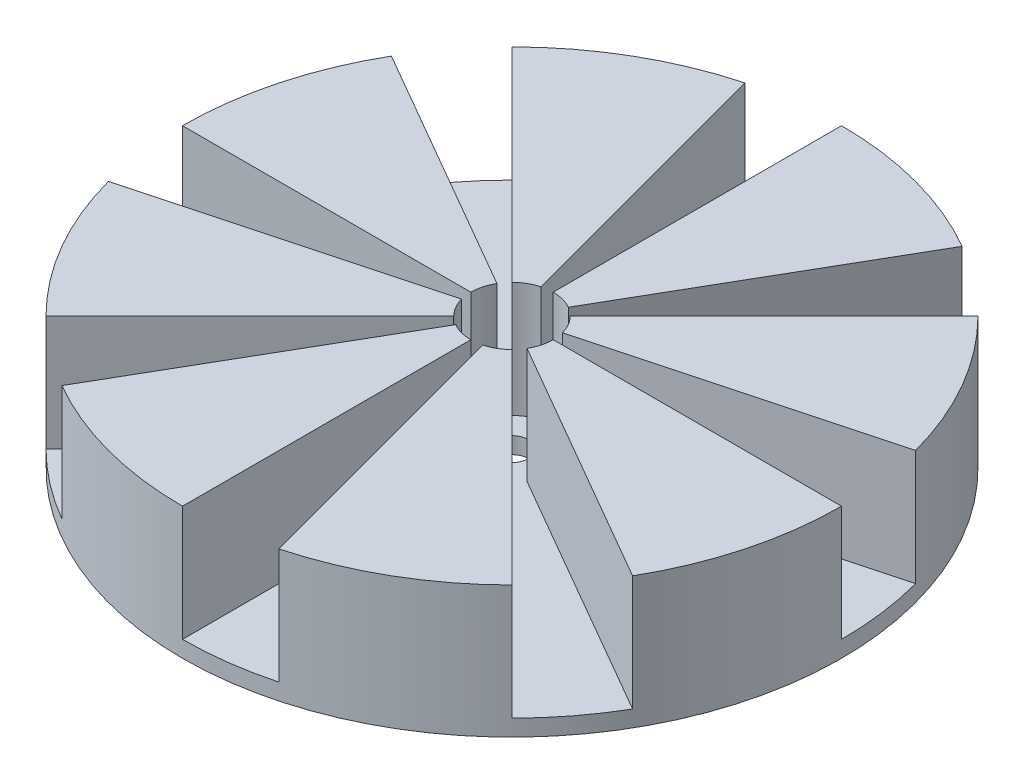
ISO-10303-21;
HEADER;
FILE_DESCRIPTION(('STEP AP214'),'2;1');
FILE_NAME('part.step','',(''),(''),'','','');
FILE_SCHEMA(('AUTOMOTIVE_DESIGN { 1 0 10303 214 1 1 1 1 }'));
ENDSEC;
DATA;
#1=APPLICATION_CONTEXT('core data for automotive mechanical design processes');
#2=APPLICATION_PROTOCOL_DEFINITION('international standard','automotive_design',2000,#1);
#3=PRODUCT_CONTEXT('',#1,'mechanical');
#4=PRODUCT('Part','Part','',(#3));
#5=PRODUCT_RELATED_PRODUCT_CATEGORY('part','',(#4));
#6=PRODUCT_DEFINITION_FORMATION('','',#4);
#7=PRODUCT_DEFINITION_CONTEXT('part definition',#1,'design');
#8=PRODUCT_DEFINITION('design','',#6,#7);
#9=PRODUCT_DEFINITION_SHAPE('','',#8);
#10=(LENGTH_UNIT() NAMED_UNIT(*) SI_UNIT(.MILLI.,.METRE.));
#11=(NAMED_UNIT(*) PLANE_ANGLE_UNIT() SI_UNIT($,.RADIAN.));
#12=(NAMED_UNIT(*) SI_UNIT($,.STERADIAN.) SOLID_ANGLE_UNIT());
#13=UNCERTAINTY_MEASURE_WITH_UNIT(LENGTH_MEASURE(1.E-05),#10,'distance_accuracy_value','');
#14=(GEOMETRIC_REPRESENTATION_CONTEXT(3) GLOBAL_UNCERTAINTY_ASSIGNED_CONTEXT((#13)) GLOBAL_UNIT_ASSIGNED_CONTEXT((#10,
#11,#12)) REPRESENTATION_CONTEXT('',''));
#15=CARTESIAN_POINT('',(0.,0.,0.));
#16=DIRECTION('',(0.,0.,1.));
#17=DIRECTION('',(1.,0.,0.));
#18=AXIS2_PLACEMENT_3D('',#15,#16,#17);
#19=CARTESIAN_POINT('',(0.,1.,0.));
#20=DIRECTION('',(0.,1.,0.));
#21=DIRECTION('',(0.,0.,1.));
#22=AXIS2_PLACEMENT_3D('',#19,#20,#21);
#23=PLANE('',#22);
#24=CARTESIAN_POINT('',(0.,1.,0.));
#25=DIRECTION('',(0.,1.,0.));
#26=DIRECTION('',(0.,0.,1.));
#27=AXIS2_PLACEMENT_3D('',#24,#25,#26);
#28=CIRCLE('',#27,1.);
#29=CARTESIAN_POINT('',(0.,1.,1.));
#30=VERTEX_POINT('',#29);
#31=EDGE_CURVE('E364',#30,#30,#28,.T.);
#32=ORIENTED_EDGE('',*,*,#31,.F.);
#33=EDGE_LOOP('',(#32));
#34=FACE_BOUND('',#33,.T.);
#35=CARTESIAN_POINT('',(0.,1.,0.));
#36=DIRECTION('',(0.,1.,0.));
#37=DIRECTION('',(0.,0.,1.));
#38=AXIS2_PLACEMENT_3D('',#35,#36,#37);
#39=CIRCLE('',#38,20.);
#40=CARTESIAN_POINT('',(-20.,1.,0.));
#41=VERTEX_POINT('',#40);
#42=CARTESIAN_POINT('',(-19.3185165257814,1.,5.17638090205045));
#43=VERTEX_POINT('',#42);
#44=EDGE_CURVE('E12',#41,#43,#39,.T.);
#45=ORIENTED_EDGE('',*,*,#44,.T.);
#46=DIRECTION('',(-0.965925826289068,0.,0.258819045102523));
#47=VECTOR('',#46,1.);
#48=CARTESIAN_POINT('',(0.,1.,0.));
#49=LINE('',#48,#47);
#50=CARTESIAN_POINT('',(-2.41481456572267,1.,0.647047612756305));
#51=VERTEX_POINT('',#50);
#52=EDGE_CURVE('E146',#51,#43,#49,.T.);
#53=ORIENTED_EDGE('',*,*,#52,.F.);
#54=CARTESIAN_POINT('',(0.,1.,0.));
#55=DIRECTION('',(0.,1.,0.));
#56=DIRECTION('',(0.,0.,1.));
#57=AXIS2_PLACEMENT_3D('',#54,#55,#56);
#58=CIRCLE('',#57,2.5);
#59=CARTESIAN_POINT('',(-1.76776695296636,1.,1.76776695296638));
#60=VERTEX_POINT('',#59);
#61=EDGE_CURVE('E151',#51,#60,#58,.T.);
#62=ORIENTED_EDGE('',*,*,#61,.T.);
#63=DIRECTION('',(-0.707106781186545,0.,0.70710678118655));
#64=VECTOR('',#63,1.);
#65=CARTESIAN_POINT('',(0.,1.,0.));
#66=LINE('',#65,#64);
#67=CARTESIAN_POINT('',(-14.1421356237309,1.,14.142135623731));
#68=VERTEX_POINT('',#67);
#69=EDGE_CURVE('E360',#60,#68,#66,.T.);
#70=ORIENTED_EDGE('',*,*,#69,.T.);
#71=CARTESIAN_POINT('',(-9.99999999999991,1.,17.3205080756888));
#72=VERTEX_POINT('',#71);
#73=EDGE_CURVE('E139',#68,#72,#39,.T.);
#74=ORIENTED_EDGE('',*,*,#73,.T.);
#75=DIRECTION('',(-0.499999999999995,0.,0.866025403784441));
#76=VECTOR('',#75,1.);
#77=CARTESIAN_POINT('',(0.,1.,0.));
#78=LINE('',#77,#76);
#79=CARTESIAN_POINT('',(-1.24999999999999,1.,2.1650635094611));
#80=VERTEX_POINT('',#79);
#81=EDGE_CURVE('E389',#80,#72,#78,.T.);
#82=ORIENTED_EDGE('',*,*,#81,.F.);
#83=CARTESIAN_POINT('',(0.,1.,0.));
#84=DIRECTION('',(0.,1.,0.));
#85=DIRECTION('',(0.,0.,1.));
#86=AXIS2_PLACEMENT_3D('',#83,#84,#85);
#87=CIRCLE('',#86,2.5);
#88=CARTESIAN_POINT('',(0.,1.,2.5));
#89=VERTEX_POINT('',#88);
#90=EDGE_CURVE('E346',#80,#89,#87,.T.);
#91=ORIENTED_EDGE('',*,*,#90,.T.);
#92=DIRECTION('',(0.,0.,1.));
#93=VECTOR('',#92,1.);
#94=CARTESIAN_POINT('',(0.,1.,0.));
#95=LINE('',#94,#93);
#96=CARTESIAN_POINT('',(0.,1.,20.));
#97=VERTEX_POINT('',#96);
#98=EDGE_CURVE('E380',#89,#97,#95,.T.);
#99=ORIENTED_EDGE('',*,*,#98,.T.);
#100=CARTESIAN_POINT('',(5.17638090205044,1.,19.3185165257814));
#101=VERTEX_POINT('',#100);
#102=EDGE_CURVE('E601',#97,#101,#39,.T.);
#103=ORIENTED_EDGE('',*,*,#102,.T.);
#104=DIRECTION('',(0.258819045102522,0.,0.965925826289068));
#105=VECTOR('',#104,1.);
#106=CARTESIAN_POINT('',(0.,1.,0.));
#107=LINE('',#106,#105);
#108=CARTESIAN_POINT('',(0.647047612756304,1.,2.41481456572267));
#109=VERTEX_POINT('',#108);
#110=EDGE_CURVE('E419',#109,#101,#107,.T.);
#111=ORIENTED_EDGE('',*,*,#110,.F.);
#112=CARTESIAN_POINT('',(0.,1.,0.));
#113=DIRECTION('',(0.,1.,0.));
#114=DIRECTION('',(0.,0.,1.));
#115=AXIS2_PLACEMENT_3D('',#112,#113,#114);
#116=CIRCLE('',#115,2.5);
#117=CARTESIAN_POINT('',(1.76776695296636,1.,1.76776695296638));
#118=VERTEX_POINT('',#117);
#119=EDGE_CURVE('E405',#109,#118,#116,.T.);
#120=ORIENTED_EDGE('',*,*,#119,.T.);
#121=DIRECTION('',(0.707106781186545,0.,0.70710678118655));
#122=VECTOR('',#121,1.);
#123=CARTESIAN_POINT('',(0.,1.,0.));
#124=LINE('',#123,#122);
#125=CARTESIAN_POINT('',(14.1421356237309,1.,14.142135623731));
#126=VERTEX_POINT('',#125);
#127=EDGE_CURVE('E410',#118,#126,#124,.T.);
#128=ORIENTED_EDGE('',*,*,#127,.T.);
#129=CARTESIAN_POINT('',(17.3205080756887,1.,10.));
#130=VERTEX_POINT('',#129);
#131=EDGE_CURVE('E599',#126,#130,#39,.T.);
#132=ORIENTED_EDGE('',*,*,#131,.T.);
#133=DIRECTION('',(0.866025403784437,0.,0.500000000000003));
#134=VECTOR('',#133,1.);
#135=CARTESIAN_POINT('',(0.,1.,0.));
#136=LINE('',#135,#134);
#137=CARTESIAN_POINT('',(2.16506350946109,1.,1.25000000000001));
#138=VERTEX_POINT('',#137);
#139=EDGE_CURVE('E449',#138,#130,#136,.T.);
#140=ORIENTED_EDGE('',*,*,#139,.F.);
#141=CARTESIAN_POINT('',(0.,1.,0.));
#142=DIRECTION('',(0.,1.,0.));
#143=DIRECTION('',(0.,0.,1.));
#144=AXIS2_PLACEMENT_3D('',#141,#142,#143);
#145=CIRCLE('',#144,2.5);
#146=CARTESIAN_POINT('',(2.5,1.,0.));
#147=VERTEX_POINT('',#146);
#148=EDGE_CURVE('E435',#138,#147,#145,.T.);
#149=ORIENTED_EDGE('',*,*,#148,.T.);
#150=DIRECTION('',(1.,0.,0.));
#151=VECTOR('',#150,1.);
#152=CARTESIAN_POINT('',(0.,1.,0.));
#153=LINE('',#152,#151);
#154=CARTESIAN_POINT('',(20.,1.,0.));
#155=VERTEX_POINT('',#154);
#156=EDGE_CURVE('E440',#147,#155,#153,.T.);
#157=ORIENTED_EDGE('',*,*,#156,.T.);
#158=CARTESIAN_POINT('',(19.3185165257814,1.,-5.17638090205046));
#159=VERTEX_POINT('',#158);
#160=EDGE_CURVE('E597',#155,#159,#39,.T.);
#161=ORIENTED_EDGE('',*,*,#160,.T.);
#162=DIRECTION('',(-0.965925826289068,0.,0.258819045102523));
#163=VECTOR('',#162,1.);
#164=CARTESIAN_POINT('',(0.,1.,0.));
#165=LINE('',#164,#163);
#166=CARTESIAN_POINT('',(2.41481456572267,1.,-0.647047612756306));
#167=VERTEX_POINT('',#166);
#168=EDGE_CURVE('E479',#159,#167,#165,.T.);
#169=ORIENTED_EDGE('',*,*,#168,.T.);
#170=CARTESIAN_POINT('',(0.,1.,0.));
#171=DIRECTION('',(0.,1.,0.));
#172=DIRECTION('',(0.,0.,1.));
#173=AXIS2_PLACEMENT_3D('',#170,#171,#172);
#174=CIRCLE('',#173,2.5);
#175=CARTESIAN_POINT('',(1.76776695296636,1.,-1.76776695296638));
#176=VERTEX_POINT('',#175);
#177=EDGE_CURVE('E465',#167,#176,#174,.T.);
#178=ORIENTED_EDGE('',*,*,#177,.T.);
#179=DIRECTION('',(-0.707106781186545,0.,0.70710678118655));
#180=VECTOR('',#179,1.);
#181=CARTESIAN_POINT('',(0.,1.,0.));
#182=LINE('',#181,#180);
#183=CARTESIAN_POINT('',(14.1421356237309,1.,-14.142135623731));
#184=VERTEX_POINT('',#183);
#185=EDGE_CURVE('E470',#184,#176,#182,.T.);
#186=ORIENTED_EDGE('',*,*,#185,.F.);
#187=CARTESIAN_POINT('',(9.9999999999999,1.,-17.3205080756888));
#188=VERTEX_POINT('',#187);
#189=EDGE_CURVE('E594',#184,#188,#39,.T.);
#190=ORIENTED_EDGE('',*,*,#189,.T.);
#191=DIRECTION('',(-0.499999999999995,0.,0.866025403784441));
#192=VECTOR('',#191,1.);
#193=CARTESIAN_POINT('',(0.,1.,0.));
#194=LINE('',#193,#192);
#195=CARTESIAN_POINT('',(1.24999999999999,1.,-2.1650635094611));
#196=VERTEX_POINT('',#195);
#197=EDGE_CURVE('E509',#188,#196,#194,.T.);
#198=ORIENTED_EDGE('',*,*,#197,.T.);
#199=CARTESIAN_POINT('',(0.,1.,0.));
#200=DIRECTION('',(0.,1.,0.));
#201=DIRECTION('',(0.,0.,1.));
#202=AXIS2_PLACEMENT_3D('',#199,#200,#201);
#203=CIRCLE('',#202,2.5);
#204=CARTESIAN_POINT('',(0.,1.,-2.5));
#205=VERTEX_POINT('',#204);
#206=EDGE_CURVE('E494',#196,#205,#203,.T.);
#207=ORIENTED_EDGE('',*,*,#206,.T.);
#208=DIRECTION('',(0.,0.,-1.));
#209=VECTOR('',#208,1.);
#210=CARTESIAN_POINT('',(0.,1.,0.));
#211=LINE('',#210,#209);
#212=CARTESIAN_POINT('',(0.,1.,-20.));
#213=VERTEX_POINT('',#212);
#214=EDGE_CURVE('E499',#205,#213,#211,.T.);
#215=ORIENTED_EDGE('',*,*,#214,.T.);
#216=CARTESIAN_POINT('',(-5.17638090205043,1.,-19.3185165257814));
#217=VERTEX_POINT('',#216);
#218=EDGE_CURVE('E582',#213,#217,#39,.T.);
#219=ORIENTED_EDGE('',*,*,#218,.T.);
#220=DIRECTION('',(-0.258819045102522,0.,-0.965925826289068));
#221=VECTOR('',#220,1.);
#222=CARTESIAN_POINT('',(0.,1.,0.));
#223=LINE('',#222,#221);
#224=CARTESIAN_POINT('',(-0.647047612756304,1.,-2.41481456572267));
#225=VERTEX_POINT('',#224);
#226=EDGE_CURVE('E537',#225,#217,#223,.T.);
#227=ORIENTED_EDGE('',*,*,#226,.F.);
#228=CARTESIAN_POINT('',(0.,1.,0.));
#229=DIRECTION('',(0.,1.,0.));
#230=DIRECTION('',(0.,0.,1.));
#231=AXIS2_PLACEMENT_3D('',#228,#229,#230);
#232=CIRCLE('',#231,2.5);
#233=CARTESIAN_POINT('',(-1.76776695296636,1.,-1.76776695296638));
#234=VERTEX_POINT('',#233);
#235=EDGE_CURVE('E524',#225,#234,#232,.T.);
#236=ORIENTED_EDGE('',*,*,#235,.T.);
#237=DIRECTION('',(0.707106781186545,0.,0.70710678118655));
#238=VECTOR('',#237,1.);
#239=CARTESIAN_POINT('',(0.,1.,0.));
#240=LINE('',#239,#238);
#241=CARTESIAN_POINT('',(-14.1421356237309,1.,-14.142135623731));
#242=VERTEX_POINT('',#241);
#243=EDGE_CURVE('E529',#242,#234,#240,.T.);
#244=ORIENTED_EDGE('',*,*,#243,.F.);
#245=CARTESIAN_POINT('',(-17.3205080756887,1.,-10.0000000000001));
#246=VERTEX_POINT('',#245);
#247=EDGE_CURVE('E579',#242,#246,#39,.T.);
#248=ORIENTED_EDGE('',*,*,#247,.T.);
#249=DIRECTION('',(0.866025403784437,0.,0.500000000000003));
#250=VECTOR('',#249,1.);
#251=CARTESIAN_POINT('',(0.,1.,0.));
#252=LINE('',#251,#250);
#253=CARTESIAN_POINT('',(-2.16506350946109,1.,-1.25000000000001));
#254=VERTEX_POINT('',#253);
#255=EDGE_CURVE('E569',#246,#254,#252,.T.);
#256=ORIENTED_EDGE('',*,*,#255,.T.);
#257=CARTESIAN_POINT('',(0.,1.,0.));
#258=DIRECTION('',(0.,1.,0.));
#259=DIRECTION('',(0.,0.,1.));
#260=AXIS2_PLACEMENT_3D('',#257,#258,#259);
#261=CIRCLE('',#260,2.5);
#262=CARTESIAN_POINT('',(-2.5,1.,0.));
#263=VERTEX_POINT('',#262);
#264=EDGE_CURVE('E553',#254,#263,#261,.T.);
#265=ORIENTED_EDGE('',*,*,#264,.T.);
#266=DIRECTION('',(-1.,0.,0.));
#267=VECTOR('',#266,1.);
#268=CARTESIAN_POINT('',(0.,1.,0.));
#269=LINE('',#268,#267);
#270=EDGE_CURVE('E558',#263,#41,#269,.T.);
#271=ORIENTED_EDGE('',*,*,#270,.T.);
#272=EDGE_LOOP('',(#45,#53,#62,#70,#74,#82,#91,#99,#103,#111,#120,#128,#132,#140,#149,#157,#161,
#169,#178,#186,#190,#198,#207,#215,#219,#227,#236,#244,#248,#256,#265,#271));
#273=FACE_BOUND('',#272,.T.);
#274=ADVANCED_FACE('F130',(#34,#273),#23,.T.);
#275=CARTESIAN_POINT('',(0.,1.,0.));
#276=DIRECTION('',(0.,-1.,0.));
#277=DIRECTION('',(0.,0.,-1.));
#278=AXIS2_PLACEMENT_3D('',#275,#276,#277);
#279=CYLINDRICAL_SURFACE('',#278,20.);
#280=ORIENTED_EDGE('',*,*,#44,.F.);
#281=DIRECTION('',(0.,-1.,0.));
#282=VECTOR('',#281,1.);
#283=CARTESIAN_POINT('',(-20.,8.,0.));
#284=LINE('',#283,#282);
#285=CARTESIAN_POINT('',(-20.,8.,0.));
#286=VERTEX_POINT('',#285);
#287=EDGE_CURVE('E661',#286,#41,#284,.T.);
#288=ORIENTED_EDGE('',*,*,#287,.F.);
#289=CARTESIAN_POINT('',(0.,8.,0.));
#290=DIRECTION('',(0.,1.,0.));
#291=DIRECTION('',(0.,0.,1.));
#292=AXIS2_PLACEMENT_3D('',#289,#290,#291);
#293=CIRCLE('',#292,20.);
#294=CARTESIAN_POINT('',(-17.3205080756887,8.,-10.0000000000001));
#295=VERTEX_POINT('',#294);
#296=EDGE_CURVE('E561',#295,#286,#293,.T.);
#297=ORIENTED_EDGE('',*,*,#296,.F.);
#298=DIRECTION('',(0.,-1.,0.));
#299=VECTOR('',#298,1.);
#300=CARTESIAN_POINT('',(-17.3205080756887,8.,-10.0000000000001));
#301=LINE('',#300,#299);
#302=EDGE_CURVE('E656',#295,#246,#301,.T.);
#303=ORIENTED_EDGE('',*,*,#302,.T.);
#304=ORIENTED_EDGE('',*,*,#247,.F.);
#305=DIRECTION('',(0.,-1.,0.));
#306=VECTOR('',#305,1.);
#307=CARTESIAN_POINT('',(-14.1421356237309,8.,-14.142135623731));
#308=LINE('',#307,#306);
#309=CARTESIAN_POINT('',(-14.1421356237309,8.,-14.142135623731));
#310=VERTEX_POINT('',#309);
#311=EDGE_CURVE('E544',#310,#242,#308,.T.);
#312=ORIENTED_EDGE('',*,*,#311,.F.);
#313=CARTESIAN_POINT('',(0.,8.,0.));
#314=DIRECTION('',(0.,1.,0.));
#315=DIRECTION('',(0.,0.,1.));
#316=AXIS2_PLACEMENT_3D('',#313,#314,#315);
#317=CIRCLE('',#316,20.);
#318=CARTESIAN_POINT('',(-5.17638090205043,8.,-19.3185165257814));
#319=VERTEX_POINT('',#318);
#320=EDGE_CURVE('E531',#319,#310,#317,.T.);
#321=ORIENTED_EDGE('',*,*,#320,.F.);
#322=DIRECTION('',(0.,-1.,0.));
#323=VECTOR('',#322,1.);
#324=CARTESIAN_POINT('',(-5.17638090205043,8.,-19.3185165257814));
#325=LINE('',#324,#323);
#326=EDGE_CURVE('E547',#319,#217,#325,.T.);
#327=ORIENTED_EDGE('',*,*,#326,.T.);
#328=ORIENTED_EDGE('',*,*,#218,.F.);
#329=DIRECTION('',(0.,-1.,0.));
#330=VECTOR('',#329,1.);
#331=CARTESIAN_POINT('',(0.,8.,-20.));
#332=LINE('',#331,#330);
#333=CARTESIAN_POINT('',(0.,8.,-20.));
#334=VERTEX_POINT('',#333);
#335=EDGE_CURVE('E515',#334,#213,#332,.T.);
#336=ORIENTED_EDGE('',*,*,#335,.F.);
#337=CARTESIAN_POINT('',(0.,8.,0.));
#338=DIRECTION('',(0.,1.,0.));
#339=DIRECTION('',(0.,0.,1.));
#340=AXIS2_PLACEMENT_3D('',#337,#338,#339);
#341=CIRCLE('',#340,20.);
#342=CARTESIAN_POINT('',(9.9999999999999,8.,-17.3205080756888));
#343=VERTEX_POINT('',#342);
#344=EDGE_CURVE('E502',#343,#334,#341,.T.);
#345=ORIENTED_EDGE('',*,*,#344,.F.);
#346=DIRECTION('',(0.,-1.,0.));
#347=VECTOR('',#346,1.);
#348=CARTESIAN_POINT('',(9.9999999999999,8.,-17.3205080756888));
#349=LINE('',#348,#347);
#350=EDGE_CURVE('E518',#343,#188,#349,.T.);
#351=ORIENTED_EDGE('',*,*,#350,.T.);
#352=ORIENTED_EDGE('',*,*,#189,.F.);
#353=DIRECTION('',(0.,-1.,0.));
#354=VECTOR('',#353,1.);
#355=CARTESIAN_POINT('',(14.1421356237309,8.,-14.142135623731));
#356=LINE('',#355,#354);
#357=CARTESIAN_POINT('',(14.1421356237309,8.,-14.142135623731));
#358=VERTEX_POINT('',#357);
#359=EDGE_CURVE('E485',#358,#184,#356,.T.);
#360=ORIENTED_EDGE('',*,*,#359,.F.);
#361=CARTESIAN_POINT('',(0.,8.,0.));
#362=DIRECTION('',(0.,1.,0.));
#363=DIRECTION('',(0.,0.,1.));
#364=AXIS2_PLACEMENT_3D('',#361,#362,#363);
#365=CIRCLE('',#364,20.);
#366=CARTESIAN_POINT('',(19.3185165257814,8.,-5.17638090205046));
#367=VERTEX_POINT('',#366);
#368=EDGE_CURVE('E473',#367,#358,#365,.T.);
#369=ORIENTED_EDGE('',*,*,#368,.F.);
#370=DIRECTION('',(0.,-1.,0.));
#371=VECTOR('',#370,1.);
#372=CARTESIAN_POINT('',(19.3185165257814,8.,-5.17638090205046));
#373=LINE('',#372,#371);
#374=EDGE_CURVE('E488',#367,#159,#373,.T.);
#375=ORIENTED_EDGE('',*,*,#374,.T.);
#376=ORIENTED_EDGE('',*,*,#160,.F.);
#377=DIRECTION('',(0.,-1.,0.));
#378=VECTOR('',#377,1.);
#379=CARTESIAN_POINT('',(20.,8.,0.));
#380=LINE('',#379,#378);
#381=CARTESIAN_POINT('',(20.,8.,0.));
#382=VERTEX_POINT('',#381);
#383=EDGE_CURVE('E456',#382,#155,#380,.T.);
#384=ORIENTED_EDGE('',*,*,#383,.F.);
#385=CARTESIAN_POINT('',(0.,8.,0.));
#386=DIRECTION('',(0.,1.,0.));
#387=DIRECTION('',(0.,0.,1.));
#388=AXIS2_PLACEMENT_3D('',#385,#386,#387);
#389=CIRCLE('',#388,20.);
#390=CARTESIAN_POINT('',(17.3205080756887,8.,10.));
#391=VERTEX_POINT('',#390);
#392=EDGE_CURVE('E442',#391,#382,#389,.T.);
#393=ORIENTED_EDGE('',*,*,#392,.F.);
#394=DIRECTION('',(0.,-1.,0.));
#395=VECTOR('',#394,1.);
#396=CARTESIAN_POINT('',(17.3205080756887,8.,10.));
#397=LINE('',#396,#395);
#398=EDGE_CURVE('E459',#391,#130,#397,.T.);
#399=ORIENTED_EDGE('',*,*,#398,.T.);
#400=ORIENTED_EDGE('',*,*,#131,.F.);
#401=DIRECTION('',(0.,-1.,0.));
#402=VECTOR('',#401,1.);
#403=CARTESIAN_POINT('',(14.1421356237309,8.,14.142135623731));
#404=LINE('',#403,#402);
#405=CARTESIAN_POINT('',(14.1421356237309,8.,14.142135623731));
#406=VERTEX_POINT('',#405);
#407=EDGE_CURVE('E426',#406,#126,#404,.T.);
#408=ORIENTED_EDGE('',*,*,#407,.F.);
#409=CARTESIAN_POINT('',(0.,8.,0.));
#410=DIRECTION('',(0.,1.,0.));
#411=DIRECTION('',(0.,0.,1.));
#412=AXIS2_PLACEMENT_3D('',#409,#410,#411);
#413=CIRCLE('',#412,20.);
#414=CARTESIAN_POINT('',(5.17638090205044,8.,19.3185165257814));
#415=VERTEX_POINT('',#414);
#416=EDGE_CURVE('E412',#415,#406,#413,.T.);
#417=ORIENTED_EDGE('',*,*,#416,.F.);
#418=DIRECTION('',(0.,-1.,0.));
#419=VECTOR('',#418,1.);
#420=CARTESIAN_POINT('',(5.17638090205044,8.,19.3185165257814));
#421=LINE('',#420,#419);
#422=EDGE_CURVE('E429',#415,#101,#421,.T.);
#423=ORIENTED_EDGE('',*,*,#422,.T.);
#424=ORIENTED_EDGE('',*,*,#102,.F.);
#425=DIRECTION('',(0.,-1.,0.));
#426=VECTOR('',#425,1.);
#427=CARTESIAN_POINT('',(0.,8.,20.));
#428=LINE('',#427,#426);
#429=CARTESIAN_POINT('',(0.,8.,20.));
#430=VERTEX_POINT('',#429);
#431=EDGE_CURVE('E396',#430,#97,#428,.T.);
#432=ORIENTED_EDGE('',*,*,#431,.F.);
#433=CARTESIAN_POINT('',(0.,8.,0.));
#434=DIRECTION('',(0.,1.,0.));
#435=DIRECTION('',(0.,0.,1.));
#436=AXIS2_PLACEMENT_3D('',#433,#434,#435);
#437=CIRCLE('',#436,20.);
#438=CARTESIAN_POINT('',(-9.99999999999991,8.,17.3205080756888));
#439=VERTEX_POINT('',#438);
#440=EDGE_CURVE('E382',#439,#430,#437,.T.);
#441=ORIENTED_EDGE('',*,*,#440,.F.);
#442=DIRECTION('',(0.,-1.,0.));
#443=VECTOR('',#442,1.);
#444=CARTESIAN_POINT('',(-9.99999999999991,8.,17.3205080756888));
#445=LINE('',#444,#443);
#446=EDGE_CURVE('E399',#439,#72,#445,.T.);
#447=ORIENTED_EDGE('',*,*,#446,.T.);
#448=ORIENTED_EDGE('',*,*,#73,.F.);
#449=DIRECTION('',(0.,-1.,0.));
#450=VECTOR('',#449,1.);
#451=CARTESIAN_POINT('',(-14.1421356237309,8.,14.142135623731));
#452=LINE('',#451,#450);
#453=CARTESIAN_POINT('',(-14.1421356237309,8.,14.142135623731));
#454=VERTEX_POINT('',#453);
#455=EDGE_CURVE('E372',#454,#68,#452,.T.);
#456=ORIENTED_EDGE('',*,*,#455,.F.);
#457=CARTESIAN_POINT('',(0.,8.,0.));
#458=DIRECTION('',(0.,1.,0.));
#459=DIRECTION('',(0.,0.,1.));
#460=AXIS2_PLACEMENT_3D('',#457,#458,#459);
#461=CIRCLE('',#460,20.);
#462=CARTESIAN_POINT('',(-19.3185165257814,8.,5.17638090205045));
#463=VERTEX_POINT('',#462);
#464=EDGE_CURVE('E355',#463,#454,#461,.T.);
#465=ORIENTED_EDGE('',*,*,#464,.F.);
#466=DIRECTION('',(0.,-1.,0.));
#467=VECTOR('',#466,1.);
#468=CARTESIAN_POINT('',(-19.3185165257814,8.,5.17638090205045));
#469=LINE('',#468,#467);
#470=EDGE_CURVE('E347',#463,#43,#469,.T.);
#471=ORIENTED_EDGE('',*,*,#470,.T.);
#472=EDGE_LOOP('',(#280,#288,#297,#303,#304,#312,#321,#327,#328,#336,#345,#351,#352,#360,#369,
#375,#376,#384,#393,#399,#400,#408,#417,#423,#424,#432,#441,#447,#448,#456,#465,#471));
#473=FACE_BOUND('',#472,.T.);
#474=CARTESIAN_POINT('',(0.,0.,0.));
#475=DIRECTION('',(0.,1.,0.));
#476=DIRECTION('',(0.,0.,1.));
#477=AXIS2_PLACEMENT_3D('',#474,#475,#476);
#478=CIRCLE('',#477,20.);
#479=CARTESIAN_POINT('',(0.,0.,20.));
#480=VERTEX_POINT('',#479);
#481=EDGE_CURVE('E583',#480,#480,#478,.T.);
#482=ORIENTED_EDGE('',*,*,#481,.T.);
#483=EDGE_LOOP('',(#482));
#484=FACE_BOUND('',#483,.T.);
#485=ADVANCED_FACE('F132',(#473,#484),#279,.T.);
#486=CARTESIAN_POINT('',(0.,0.,0.));
#487=DIRECTION('',(0.,1.,0.));
#488=DIRECTION('',(0.,0.,1.));
#489=AXIS2_PLACEMENT_3D('',#486,#487,#488);
#490=PLANE('',#489);
#491=CARTESIAN_POINT('',(0.,0.,0.));
#492=DIRECTION('',(0.,1.,0.));
#493=DIRECTION('',(0.,0.,1.));
#494=AXIS2_PLACEMENT_3D('',#491,#492,#493);
#495=CIRCLE('',#494,1.);
#496=CARTESIAN_POINT('',(0.,0.,1.));
#497=VERTEX_POINT('',#496);
#498=EDGE_CURVE('E134',#497,#497,#495,.T.);
#499=ORIENTED_EDGE('',*,*,#498,.T.);
#500=EDGE_LOOP('',(#499));
#501=FACE_BOUND('',#500,.T.);
#502=ORIENTED_EDGE('',*,*,#481,.F.);
#503=EDGE_LOOP('',(#502));
#504=FACE_BOUND('',#503,.T.);
#505=ADVANCED_FACE('F637',(#501,#504),#490,.F.);
#506=CARTESIAN_POINT('',(0.,8.,0.));
#507=DIRECTION('',(0.,-1.,0.));
#508=DIRECTION('',(0.,0.,-1.));
#509=AXIS2_PLACEMENT_3D('',#506,#507,#508);
#510=CYLINDRICAL_SURFACE('',#509,2.5);
#511=ORIENTED_EDGE('',*,*,#264,.F.);
#512=DIRECTION('',(0.,-1.,0.));
#513=VECTOR('',#512,1.);
#514=CARTESIAN_POINT('',(-2.16506350946109,8.,-1.25000000000001));
#515=LINE('',#514,#513);
#516=CARTESIAN_POINT('',(-2.16506350946109,8.,-1.25000000000001));
#517=VERTEX_POINT('',#516);
#518=EDGE_CURVE('E654',#517,#254,#515,.T.);
#519=ORIENTED_EDGE('',*,*,#518,.F.);
#520=CARTESIAN_POINT('',(0.,8.,0.));
#521=DIRECTION('',(0.,1.,0.));
#522=DIRECTION('',(0.,0.,1.));
#523=AXIS2_PLACEMENT_3D('',#520,#521,#522);
#524=CIRCLE('',#523,2.5);
#525=CARTESIAN_POINT('',(-2.5,8.,0.));
#526=VERTEX_POINT('',#525);
#527=EDGE_CURVE('E554',#517,#526,#524,.T.);
#528=ORIENTED_EDGE('',*,*,#527,.T.);
#529=DIRECTION('',(0.,-1.,0.));
#530=VECTOR('',#529,1.);
#531=CARTESIAN_POINT('',(-2.5,8.,0.));
#532=LINE('',#531,#530);
#533=EDGE_CURVE('E566',#526,#263,#532,.T.);
#534=ORIENTED_EDGE('',*,*,#533,.T.);
#535=EDGE_LOOP('',(#511,#519,#528,#534));
#536=FACE_BOUND('',#535,.T.);
#537=ADVANCED_FACE('F640',(#536),#510,.F.);
#538=CARTESIAN_POINT('',(0.,8.,0.));
#539=DIRECTION('',(0.500000000000003,0.,-0.866025403784437));
#540=DIRECTION('',(-0.866025403784437,0.,-0.500000000000003));
#541=AXIS2_PLACEMENT_3D('',#538,#539,#540);
#542=PLANE('',#541);
#543=ORIENTED_EDGE('',*,*,#255,.F.);
#544=ORIENTED_EDGE('',*,*,#302,.F.);
#545=DIRECTION('',(0.866025403784437,0.,0.500000000000003));
#546=VECTOR('',#545,1.);
#547=CARTESIAN_POINT('',(0.,8.,0.));
#548=LINE('',#547,#546);
#549=EDGE_CURVE('E557',#295,#517,#548,.T.);
#550=ORIENTED_EDGE('',*,*,#549,.T.);
#551=ORIENTED_EDGE('',*,*,#518,.T.);
#552=EDGE_LOOP('',(#543,#544,#550,#551));
#553=FACE_BOUND('',#552,.T.);
#554=ADVANCED_FACE('F647',(#553),#542,.T.);
#555=CARTESIAN_POINT('',(0.,8.,0.));
#556=DIRECTION('',(0.,0.,1.));
#557=DIRECTION('',(1.,0.,0.));
#558=AXIS2_PLACEMENT_3D('',#555,#556,#557);
#559=PLANE('',#558);
#560=ORIENTED_EDGE('',*,*,#270,.F.);
#561=ORIENTED_EDGE('',*,*,#533,.F.);
#562=DIRECTION('',(-1.,0.,0.));
#563=VECTOR('',#562,1.);
#564=CARTESIAN_POINT('',(0.,8.,0.));
#565=LINE('',#564,#563);
#566=EDGE_CURVE('E563',#526,#286,#565,.T.);
#567=ORIENTED_EDGE('',*,*,#566,.T.);
#568=ORIENTED_EDGE('',*,*,#287,.T.);
#569=EDGE_LOOP('',(#560,#561,#567,#568));
#570=FACE_BOUND('',#569,.T.);
#571=ADVANCED_FACE('F677',(#570),#559,.T.);
#572=CARTESIAN_POINT('',(0.,8.,0.));
#573=DIRECTION('',(0.,1.,0.));
#574=DIRECTION('',(0.,0.,1.));
#575=AXIS2_PLACEMENT_3D('',#572,#573,#574);
#576=PLANE('',#575);
#577=ORIENTED_EDGE('',*,*,#527,.F.);
#578=ORIENTED_EDGE('',*,*,#549,.F.);
#579=ORIENTED_EDGE('',*,*,#296,.T.);
#580=ORIENTED_EDGE('',*,*,#566,.F.);
#581=EDGE_LOOP('',(#577,#578,#579,#580));
#582=FACE_BOUND('',#581,.T.);
#583=ADVANCED_FACE('F674',(#582),#576,.T.);
#584=CARTESIAN_POINT('',(0.,8.,0.));
#585=DIRECTION('',(0.,-1.,0.));
#586=DIRECTION('',(0.,0.,-1.));
#587=AXIS2_PLACEMENT_3D('',#584,#585,#586);
#588=CYLINDRICAL_SURFACE('',#587,2.5);
#589=ORIENTED_EDGE('',*,*,#235,.F.);
#590=DIRECTION('',(0.,-1.,0.));
#591=VECTOR('',#590,1.);
#592=CARTESIAN_POINT('',(-0.647047612756304,8.,-2.41481456572267));
#593=LINE('',#592,#591);
#594=CARTESIAN_POINT('',(-0.647047612756304,8.,-2.41481456572267));
#595=VERTEX_POINT('',#594);
#596=EDGE_CURVE('E550',#595,#225,#593,.T.);
#597=ORIENTED_EDGE('',*,*,#596,.F.);
#598=CARTESIAN_POINT('',(0.,8.,0.));
#599=DIRECTION('',(0.,1.,0.));
#600=DIRECTION('',(0.,0.,1.));
#601=AXIS2_PLACEMENT_3D('',#598,#599,#600);
#602=CIRCLE('',#601,2.5);
#603=CARTESIAN_POINT('',(-1.76776695296636,8.,-1.76776695296638));
#604=VERTEX_POINT('',#603);
#605=EDGE_CURVE('E525',#595,#604,#602,.T.);
#606=ORIENTED_EDGE('',*,*,#605,.T.);
#607=DIRECTION('',(0.,-1.,0.));
#608=VECTOR('',#607,1.);
#609=CARTESIAN_POINT('',(-1.76776695296636,8.,-1.76776695296638));
#610=LINE('',#609,#608);
#611=EDGE_CURVE('E535',#604,#234,#610,.T.);
#612=ORIENTED_EDGE('',*,*,#611,.T.);
#613=EDGE_LOOP('',(#589,#597,#606,#612));
#614=FACE_BOUND('',#613,.T.);
#615=ADVANCED_FACE('F785',(#614),#588,.F.);
#616=CARTESIAN_POINT('',(0.,8.,0.));
#617=DIRECTION('',(-0.965925826289068,0.,0.258819045102522));
#618=DIRECTION('',(0.258819045102522,0.,0.965925826289068));
#619=AXIS2_PLACEMENT_3D('',#616,#617,#618);
#620=PLANE('',#619);
#621=ORIENTED_EDGE('',*,*,#226,.T.);
#622=ORIENTED_EDGE('',*,*,#326,.F.);
#623=DIRECTION('',(-0.258819045102522,0.,-0.965925826289068));
#624=VECTOR('',#623,1.);
#625=CARTESIAN_POINT('',(0.,8.,0.));
#626=LINE('',#625,#624);
#627=EDGE_CURVE('E528',#595,#319,#626,.T.);
#628=ORIENTED_EDGE('',*,*,#627,.F.);
#629=ORIENTED_EDGE('',*,*,#596,.T.);
#630=EDGE_LOOP('',(#621,#622,#628,#629));
#631=FACE_BOUND('',#630,.T.);
#632=ADVANCED_FACE('F793',(#631),#620,.F.);
#633=CARTESIAN_POINT('',(0.,8.,0.));
#634=DIRECTION('',(0.70710678118655,0.,-0.707106781186545));
#635=DIRECTION('',(-0.707106781186545,0.,-0.70710678118655));
#636=AXIS2_PLACEMENT_3D('',#633,#634,#635);
#637=PLANE('',#636);
#638=ORIENTED_EDGE('',*,*,#243,.T.);
#639=ORIENTED_EDGE('',*,*,#611,.F.);
#640=DIRECTION('',(0.707106781186545,0.,0.70710678118655));
#641=VECTOR('',#640,1.);
#642=CARTESIAN_POINT('',(0.,8.,0.));
#643=LINE('',#642,#641);
#644=EDGE_CURVE('E533',#310,#604,#643,.T.);
#645=ORIENTED_EDGE('',*,*,#644,.F.);
#646=ORIENTED_EDGE('',*,*,#311,.T.);
#647=EDGE_LOOP('',(#638,#639,#645,#646));
#648=FACE_BOUND('',#647,.T.);
#649=ADVANCED_FACE('F802',(#648),#637,.F.);
#650=CARTESIAN_POINT('',(0.,8.,0.));
#651=DIRECTION('',(0.,1.,0.));
#652=DIRECTION('',(0.,0.,1.));
#653=AXIS2_PLACEMENT_3D('',#650,#651,#652);
#654=PLANE('',#653);
#655=ORIENTED_EDGE('',*,*,#605,.F.);
#656=ORIENTED_EDGE('',*,*,#627,.T.);
#657=ORIENTED_EDGE('',*,*,#320,.T.);
#658=ORIENTED_EDGE('',*,*,#644,.T.);
#659=EDGE_LOOP('',(#655,#656,#657,#658));
#660=FACE_BOUND('',#659,.T.);
#661=ADVANCED_FACE('F811',(#660),#654,.T.);
#662=CARTESIAN_POINT('',(0.,8.,0.));
#663=DIRECTION('',(0.,-1.,0.));
#664=DIRECTION('',(0.,0.,-1.));
#665=AXIS2_PLACEMENT_3D('',#662,#663,#664);
#666=CYLINDRICAL_SURFACE('',#665,2.5);
#667=ORIENTED_EDGE('',*,*,#206,.F.);
#668=DIRECTION('',(0.,-1.,0.));
#669=VECTOR('',#668,1.);
#670=CARTESIAN_POINT('',(1.24999999999999,8.,-2.1650635094611));
#671=LINE('',#670,#669);
#672=CARTESIAN_POINT('',(1.24999999999999,8.,-2.1650635094611));
#673=VERTEX_POINT('',#672);
#674=EDGE_CURVE('E521',#673,#196,#671,.T.);
#675=ORIENTED_EDGE('',*,*,#674,.F.);
#676=CARTESIAN_POINT('',(0.,8.,0.));
#677=DIRECTION('',(0.,1.,0.));
#678=DIRECTION('',(0.,0.,1.));
#679=AXIS2_PLACEMENT_3D('',#676,#677,#678);
#680=CIRCLE('',#679,2.5);
#681=CARTESIAN_POINT('',(0.,8.,-2.5));
#682=VERTEX_POINT('',#681);
#683=EDGE_CURVE('E495',#673,#682,#680,.T.);
#684=ORIENTED_EDGE('',*,*,#683,.T.);
#685=DIRECTION('',(0.,-1.,0.));
#686=VECTOR('',#685,1.);
#687=CARTESIAN_POINT('',(0.,8.,-2.5));
#688=LINE('',#687,#686);
#689=EDGE_CURVE('E507',#682,#205,#688,.T.);
#690=ORIENTED_EDGE('',*,*,#689,.T.);
#691=EDGE_LOOP('',(#667,#675,#684,#690));
#692=FACE_BOUND('',#691,.T.);
#693=ADVANCED_FACE('F820',(#692),#666,.F.);
#694=CARTESIAN_POINT('',(0.,8.,0.));
#695=DIRECTION('',(0.866025403784441,0.,0.499999999999995));
#696=DIRECTION('',(0.499999999999995,0.,-0.866025403784441));
#697=AXIS2_PLACEMENT_3D('',#694,#695,#696);
#698=PLANE('',#697);
#699=ORIENTED_EDGE('',*,*,#197,.F.);
#700=ORIENTED_EDGE('',*,*,#350,.F.);
#701=DIRECTION('',(-0.499999999999995,0.,0.866025403784441));
#702=VECTOR('',#701,1.);
#703=CARTESIAN_POINT('',(0.,8.,0.));
#704=LINE('',#703,#702);
#705=EDGE_CURVE('E498',#343,#673,#704,.T.);
#706=ORIENTED_EDGE('',*,*,#705,.T.);
#707=ORIENTED_EDGE('',*,*,#674,.T.);
#708=EDGE_LOOP('',(#699,#700,#706,#707));
#709=FACE_BOUND('',#708,.T.);
#710=ADVANCED_FACE('F829',(#709),#698,.T.);
#711=CARTESIAN_POINT('',(0.,8.,0.));
#712=DIRECTION('',(-1.,0.,0.));
#713=DIRECTION('',(0.,0.,1.));
#714=AXIS2_PLACEMENT_3D('',#711,#712,#713);
#715=PLANE('',#714);
#716=ORIENTED_EDGE('',*,*,#214,.F.);
#717=ORIENTED_EDGE('',*,*,#689,.F.);
#718=DIRECTION('',(0.,0.,-1.));
#719=VECTOR('',#718,1.);
#720=CARTESIAN_POINT('',(0.,8.,0.));
#721=LINE('',#720,#719);
#722=EDGE_CURVE('E504',#682,#334,#721,.T.);
#723=ORIENTED_EDGE('',*,*,#722,.T.);
#724=ORIENTED_EDGE('',*,*,#335,.T.);
#725=EDGE_LOOP('',(#716,#717,#723,#724));
#726=FACE_BOUND('',#725,.T.);
#727=ADVANCED_FACE('F838',(#726),#715,.T.);
#728=CARTESIAN_POINT('',(0.,8.,0.));
#729=DIRECTION('',(0.,1.,0.));
#730=DIRECTION('',(0.,0.,1.));
#731=AXIS2_PLACEMENT_3D('',#728,#729,#730);
#732=PLANE('',#731);
#733=ORIENTED_EDGE('',*,*,#683,.F.);
#734=ORIENTED_EDGE('',*,*,#705,.F.);
#735=ORIENTED_EDGE('',*,*,#344,.T.);
#736=ORIENTED_EDGE('',*,*,#722,.F.);
#737=EDGE_LOOP('',(#733,#734,#735,#736));
#738=FACE_BOUND('',#737,.T.);
#739=ADVANCED_FACE('F847',(#738),#732,.T.);
#740=CARTESIAN_POINT('',(0.,8.,0.));
#741=DIRECTION('',(0.,-1.,0.));
#742=DIRECTION('',(0.,0.,-1.));
#743=AXIS2_PLACEMENT_3D('',#740,#741,#742);
#744=CYLINDRICAL_SURFACE('',#743,2.5);
#745=ORIENTED_EDGE('',*,*,#177,.F.);
#746=DIRECTION('',(0.,-1.,0.));
#747=VECTOR('',#746,1.);
#748=CARTESIAN_POINT('',(2.41481456572267,8.,-0.647047612756306));
#749=LINE('',#748,#747);
#750=CARTESIAN_POINT('',(2.41481456572267,8.,-0.647047612756306));
#751=VERTEX_POINT('',#750);
#752=EDGE_CURVE('E491',#751,#167,#749,.T.);
#753=ORIENTED_EDGE('',*,*,#752,.F.);
#754=CARTESIAN_POINT('',(0.,8.,0.));
#755=DIRECTION('',(0.,1.,0.));
#756=DIRECTION('',(0.,0.,1.));
#757=AXIS2_PLACEMENT_3D('',#754,#755,#756);
#758=CIRCLE('',#757,2.5);
#759=CARTESIAN_POINT('',(1.76776695296636,8.,-1.76776695296638));
#760=VERTEX_POINT('',#759);
#761=EDGE_CURVE('E466',#751,#760,#758,.T.);
#762=ORIENTED_EDGE('',*,*,#761,.T.);
#763=DIRECTION('',(0.,-1.,0.));
#764=VECTOR('',#763,1.);
#765=CARTESIAN_POINT('',(1.76776695296636,8.,-1.76776695296638));
#766=LINE('',#765,#764);
#767=EDGE_CURVE('E477',#760,#176,#766,.T.);
#768=ORIENTED_EDGE('',*,*,#767,.T.);
#769=EDGE_LOOP('',(#745,#753,#762,#768));
#770=FACE_BOUND('',#769,.T.);
#771=ADVANCED_FACE('F856',(#770),#744,.F.);
#772=CARTESIAN_POINT('',(0.,8.,0.));
#773=DIRECTION('',(0.258819045102523,0.,0.965925826289068));
#774=DIRECTION('',(0.965925826289068,0.,-0.258819045102523));
#775=AXIS2_PLACEMENT_3D('',#772,#773,#774);
#776=PLANE('',#775);
#777=ORIENTED_EDGE('',*,*,#168,.F.);
#778=ORIENTED_EDGE('',*,*,#374,.F.);
#779=DIRECTION('',(-0.965925826289068,0.,0.258819045102523));
#780=VECTOR('',#779,1.);
#781=CARTESIAN_POINT('',(0.,8.,0.));
#782=LINE('',#781,#780);
#783=EDGE_CURVE('E469',#367,#751,#782,.T.);
#784=ORIENTED_EDGE('',*,*,#783,.T.);
#785=ORIENTED_EDGE('',*,*,#752,.T.);
#786=EDGE_LOOP('',(#777,#778,#784,#785));
#787=FACE_BOUND('',#786,.T.);
#788=ADVANCED_FACE('F865',(#787),#776,.T.);
#789=CARTESIAN_POINT('',(0.,8.,0.));
#790=DIRECTION('',(0.70710678118655,0.,0.707106781186545));
#791=DIRECTION('',(0.707106781186545,0.,-0.70710678118655));
#792=AXIS2_PLACEMENT_3D('',#789,#790,#791);
#793=PLANE('',#792);
#794=ORIENTED_EDGE('',*,*,#185,.T.);
#795=ORIENTED_EDGE('',*,*,#767,.F.);
#796=DIRECTION('',(-0.707106781186545,0.,0.70710678118655));
#797=VECTOR('',#796,1.);
#798=CARTESIAN_POINT('',(0.,8.,0.));
#799=LINE('',#798,#797);
#800=EDGE_CURVE('E475',#358,#760,#799,.T.);
#801=ORIENTED_EDGE('',*,*,#800,.F.);
#802=ORIENTED_EDGE('',*,*,#359,.T.);
#803=EDGE_LOOP('',(#794,#795,#801,#802));
#804=FACE_BOUND('',#803,.T.);
#805=ADVANCED_FACE('F874',(#804),#793,.F.);
#806=CARTESIAN_POINT('',(0.,8.,0.));
#807=DIRECTION('',(0.,1.,0.));
#808=DIRECTION('',(0.,0.,1.));
#809=AXIS2_PLACEMENT_3D('',#806,#807,#808);
#810=PLANE('',#809);
#811=ORIENTED_EDGE('',*,*,#761,.F.);
#812=ORIENTED_EDGE('',*,*,#783,.F.);
#813=ORIENTED_EDGE('',*,*,#368,.T.);
#814=ORIENTED_EDGE('',*,*,#800,.T.);
#815=EDGE_LOOP('',(#811,#812,#813,#814));
#816=FACE_BOUND('',#815,.T.);
#817=ADVANCED_FACE('F883',(#816),#810,.T.);
#818=CARTESIAN_POINT('',(0.,8.,0.));
#819=DIRECTION('',(0.,-1.,0.));
#820=DIRECTION('',(0.,0.,-1.));
#821=AXIS2_PLACEMENT_3D('',#818,#819,#820);
#822=CYLINDRICAL_SURFACE('',#821,2.5);
#823=ORIENTED_EDGE('',*,*,#148,.F.);
#824=DIRECTION('',(0.,-1.,0.));
#825=VECTOR('',#824,1.);
#826=CARTESIAN_POINT('',(2.16506350946109,8.,1.25000000000001));
#827=LINE('',#826,#825);
#828=CARTESIAN_POINT('',(2.16506350946109,8.,1.25000000000001));
#829=VERTEX_POINT('',#828);
#830=EDGE_CURVE('E462',#829,#138,#827,.T.);
#831=ORIENTED_EDGE('',*,*,#830,.F.);
#832=CARTESIAN_POINT('',(0.,8.,0.));
#833=DIRECTION('',(0.,1.,0.));
#834=DIRECTION('',(0.,0.,1.));
#835=AXIS2_PLACEMENT_3D('',#832,#833,#834);
#836=CIRCLE('',#835,2.5);
#837=CARTESIAN_POINT('',(2.5,8.,0.));
#838=VERTEX_POINT('',#837);
#839=EDGE_CURVE('E436',#829,#838,#836,.T.);
#840=ORIENTED_EDGE('',*,*,#839,.T.);
#841=DIRECTION('',(0.,-1.,0.));
#842=VECTOR('',#841,1.);
#843=CARTESIAN_POINT('',(2.5,8.,0.));
#844=LINE('',#843,#842);
#845=EDGE_CURVE('E447',#838,#147,#844,.T.);
#846=ORIENTED_EDGE('',*,*,#845,.T.);
#847=EDGE_LOOP('',(#823,#831,#840,#846));
#848=FACE_BOUND('',#847,.T.);
#849=ADVANCED_FACE('F892',(#848),#822,.F.);
#850=CARTESIAN_POINT('',(0.,8.,0.));
#851=DIRECTION('',(0.500000000000003,0.,-0.866025403784437));
#852=DIRECTION('',(-0.866025403784437,0.,-0.500000000000003));
#853=AXIS2_PLACEMENT_3D('',#850,#851,#852);
#854=PLANE('',#853);
#855=ORIENTED_EDGE('',*,*,#139,.T.);
#856=ORIENTED_EDGE('',*,*,#398,.F.);
#857=DIRECTION('',(0.866025403784437,0.,0.500000000000003));
#858=VECTOR('',#857,1.);
#859=CARTESIAN_POINT('',(0.,8.,0.));
#860=LINE('',#859,#858);
#861=EDGE_CURVE('E439',#829,#391,#860,.T.);
#862=ORIENTED_EDGE('',*,*,#861,.F.);
#863=ORIENTED_EDGE('',*,*,#830,.T.);
#864=EDGE_LOOP('',(#855,#856,#862,#863));
#865=FACE_BOUND('',#864,.T.);
#866=ADVANCED_FACE('F901',(#865),#854,.F.);
#867=CARTESIAN_POINT('',(0.,8.,0.));
#868=DIRECTION('',(0.,0.,-1.));
#869=DIRECTION('',(-1.,0.,0.));
#870=AXIS2_PLACEMENT_3D('',#867,#868,#869);
#871=PLANE('',#870);
#872=ORIENTED_EDGE('',*,*,#156,.F.);
#873=ORIENTED_EDGE('',*,*,#845,.F.);
#874=DIRECTION('',(1.,0.,0.));
#875=VECTOR('',#874,1.);
#876=CARTESIAN_POINT('',(0.,8.,0.));
#877=LINE('',#876,#875);
#878=EDGE_CURVE('E444',#838,#382,#877,.T.);
#879=ORIENTED_EDGE('',*,*,#878,.T.);
#880=ORIENTED_EDGE('',*,*,#383,.T.);
#881=EDGE_LOOP('',(#872,#873,#879,#880));
#882=FACE_BOUND('',#881,.T.);
#883=ADVANCED_FACE('F910',(#882),#871,.T.);
#884=CARTESIAN_POINT('',(0.,8.,0.));
#885=DIRECTION('',(0.,1.,0.));
#886=DIRECTION('',(0.,0.,1.));
#887=AXIS2_PLACEMENT_3D('',#884,#885,#886);
#888=PLANE('',#887);
#889=ORIENTED_EDGE('',*,*,#839,.F.);
#890=ORIENTED_EDGE('',*,*,#861,.T.);
#891=ORIENTED_EDGE('',*,*,#392,.T.);
#892=ORIENTED_EDGE('',*,*,#878,.F.);
#893=EDGE_LOOP('',(#889,#890,#891,#892));
#894=FACE_BOUND('',#893,.T.);
#895=ADVANCED_FACE('F919',(#894),#888,.T.);
#896=CARTESIAN_POINT('',(0.,8.,0.));
#897=DIRECTION('',(0.,-1.,0.));
#898=DIRECTION('',(0.,0.,-1.));
#899=AXIS2_PLACEMENT_3D('',#896,#897,#898);
#900=CYLINDRICAL_SURFACE('',#899,2.5);
#901=ORIENTED_EDGE('',*,*,#119,.F.);
#902=DIRECTION('',(0.,-1.,0.));
#903=VECTOR('',#902,1.);
#904=CARTESIAN_POINT('',(0.647047612756304,8.,2.41481456572267));
#905=LINE('',#904,#903);
#906=CARTESIAN_POINT('',(0.647047612756304,8.,2.41481456572267));
#907=VERTEX_POINT('',#906);
#908=EDGE_CURVE('E432',#907,#109,#905,.T.);
#909=ORIENTED_EDGE('',*,*,#908,.F.);
#910=CARTESIAN_POINT('',(0.,8.,0.));
#911=DIRECTION('',(0.,1.,0.));
#912=DIRECTION('',(0.,0.,1.));
#913=AXIS2_PLACEMENT_3D('',#910,#911,#912);
#914=CIRCLE('',#913,2.5);
#915=CARTESIAN_POINT('',(1.76776695296636,8.,1.76776695296638));
#916=VERTEX_POINT('',#915);
#917=EDGE_CURVE('E406',#907,#916,#914,.T.);
#918=ORIENTED_EDGE('',*,*,#917,.T.);
#919=DIRECTION('',(0.,-1.,0.));
#920=VECTOR('',#919,1.);
#921=CARTESIAN_POINT('',(1.76776695296636,8.,1.76776695296638));
#922=LINE('',#921,#920);
#923=EDGE_CURVE('E417',#916,#118,#922,.T.);
#924=ORIENTED_EDGE('',*,*,#923,.T.);
#925=EDGE_LOOP('',(#901,#909,#918,#924));
#926=FACE_BOUND('',#925,.T.);
#927=ADVANCED_FACE('F928',(#926),#900,.F.);
#928=CARTESIAN_POINT('',(0.,8.,0.));
#929=DIRECTION('',(0.965925826289068,0.,-0.258819045102522));
#930=DIRECTION('',(-0.258819045102522,0.,-0.965925826289068));
#931=AXIS2_PLACEMENT_3D('',#928,#929,#930);
#932=PLANE('',#931);
#933=ORIENTED_EDGE('',*,*,#110,.T.);
#934=ORIENTED_EDGE('',*,*,#422,.F.);
#935=DIRECTION('',(0.258819045102522,0.,0.965925826289068));
#936=VECTOR('',#935,1.);
#937=CARTESIAN_POINT('',(0.,8.,0.));
#938=LINE('',#937,#936);
#939=EDGE_CURVE('E409',#907,#415,#938,.T.);
#940=ORIENTED_EDGE('',*,*,#939,.F.);
#941=ORIENTED_EDGE('',*,*,#908,.T.);
#942=EDGE_LOOP('',(#933,#934,#940,#941));
#943=FACE_BOUND('',#942,.T.);
#944=ADVANCED_FACE('F937',(#943),#932,.F.);
#945=CARTESIAN_POINT('',(0.,8.,0.));
#946=DIRECTION('',(0.70710678118655,0.,-0.707106781186545));
#947=DIRECTION('',(-0.707106781186545,0.,-0.70710678118655));
#948=AXIS2_PLACEMENT_3D('',#945,#946,#947);
#949=PLANE('',#948);
#950=ORIENTED_EDGE('',*,*,#127,.F.);
#951=ORIENTED_EDGE('',*,*,#923,.F.);
#952=DIRECTION('',(0.707106781186545,0.,0.70710678118655));
#953=VECTOR('',#952,1.);
#954=CARTESIAN_POINT('',(0.,8.,0.));
#955=LINE('',#954,#953);
#956=EDGE_CURVE('E414',#916,#406,#955,.T.);
#957=ORIENTED_EDGE('',*,*,#956,.T.);
#958=ORIENTED_EDGE('',*,*,#407,.T.);
#959=EDGE_LOOP('',(#950,#951,#957,#958));
#960=FACE_BOUND('',#959,.T.);
#961=ADVANCED_FACE('F946',(#960),#949,.T.);
#962=CARTESIAN_POINT('',(0.,8.,0.));
#963=DIRECTION('',(0.,1.,0.));
#964=DIRECTION('',(0.,0.,1.));
#965=AXIS2_PLACEMENT_3D('',#962,#963,#964);
#966=PLANE('',#965);
#967=ORIENTED_EDGE('',*,*,#917,.F.);
#968=ORIENTED_EDGE('',*,*,#939,.T.);
#969=ORIENTED_EDGE('',*,*,#416,.T.);
#970=ORIENTED_EDGE('',*,*,#956,.F.);
#971=EDGE_LOOP('',(#967,#968,#969,#970));
#972=FACE_BOUND('',#971,.T.);
#973=ADVANCED_FACE('F955',(#972),#966,.T.);
#974=CARTESIAN_POINT('',(0.,8.,0.));
#975=DIRECTION('',(0.,-1.,0.));
#976=DIRECTION('',(0.,0.,-1.));
#977=AXIS2_PLACEMENT_3D('',#974,#975,#976);
#978=CYLINDRICAL_SURFACE('',#977,2.5);
#979=ORIENTED_EDGE('',*,*,#90,.F.);
#980=DIRECTION('',(0.,-1.,0.));
#981=VECTOR('',#980,1.);
#982=CARTESIAN_POINT('',(-1.24999999999999,8.,2.1650635094611));
#983=LINE('',#982,#981);
#984=CARTESIAN_POINT('',(-1.24999999999999,8.,2.1650635094611));
#985=VERTEX_POINT('',#984);
#986=EDGE_CURVE('E402',#985,#80,#983,.T.);
#987=ORIENTED_EDGE('',*,*,#986,.F.);
#988=CARTESIAN_POINT('',(0.,8.,0.));
#989=DIRECTION('',(0.,1.,0.));
#990=DIRECTION('',(0.,0.,1.));
#991=AXIS2_PLACEMENT_3D('',#988,#989,#990);
#992=CIRCLE('',#991,2.5);
#993=CARTESIAN_POINT('',(0.,8.,2.5));
#994=VERTEX_POINT('',#993);
#995=EDGE_CURVE('E376',#985,#994,#992,.T.);
#996=ORIENTED_EDGE('',*,*,#995,.T.);
#997=DIRECTION('',(0.,-1.,0.));
#998=VECTOR('',#997,1.);
#999=CARTESIAN_POINT('',(0.,8.,2.5));
#1000=LINE('',#999,#998);
#1001=EDGE_CURVE('E387',#994,#89,#1000,.T.);
#1002=ORIENTED_EDGE('',*,*,#1001,.T.);
#1003=EDGE_LOOP('',(#979,#987,#996,#1002));
#1004=FACE_BOUND('',#1003,.T.);
#1005=ADVANCED_FACE('F619',(#1004),#978,.F.);
#1006=CARTESIAN_POINT('',(0.,8.,0.));
#1007=DIRECTION('',(0.866025403784441,0.,0.499999999999995));
#1008=DIRECTION('',(0.499999999999995,0.,-0.866025403784441));
#1009=AXIS2_PLACEMENT_3D('',#1006,#1007,#1008);
#1010=PLANE('',#1009);
#1011=ORIENTED_EDGE('',*,*,#81,.T.);
#1012=ORIENTED_EDGE('',*,*,#446,.F.);
#1013=DIRECTION('',(-0.499999999999995,0.,0.866025403784441));
#1014=VECTOR('',#1013,1.);
#1015=CARTESIAN_POINT('',(0.,8.,0.));
#1016=LINE('',#1015,#1014);
#1017=EDGE_CURVE('E379',#985,#439,#1016,.T.);
#1018=ORIENTED_EDGE('',*,*,#1017,.F.);
#1019=ORIENTED_EDGE('',*,*,#986,.T.);
#1020=EDGE_LOOP('',(#1011,#1012,#1018,#1019));
#1021=FACE_BOUND('',#1020,.T.);
#1022=ADVANCED_FACE('F607',(#1021),#1010,.F.);
#1023=CARTESIAN_POINT('',(0.,8.,0.));
#1024=DIRECTION('',(1.,0.,0.));
#1025=DIRECTION('',(0.,0.,-1.));
#1026=AXIS2_PLACEMENT_3D('',#1023,#1024,#1025);
#1027=PLANE('',#1026);
#1028=ORIENTED_EDGE('',*,*,#98,.F.);
#1029=ORIENTED_EDGE('',*,*,#1001,.F.);
#1030=DIRECTION('',(0.,0.,1.));
#1031=VECTOR('',#1030,1.);
#1032=CARTESIAN_POINT('',(0.,8.,0.));
#1033=LINE('',#1032,#1031);
#1034=EDGE_CURVE('E384',#994,#430,#1033,.T.);
#1035=ORIENTED_EDGE('',*,*,#1034,.T.);
#1036=ORIENTED_EDGE('',*,*,#431,.T.);
#1037=EDGE_LOOP('',(#1028,#1029,#1035,#1036));
#1038=FACE_BOUND('',#1037,.T.);
#1039=ADVANCED_FACE('F622',(#1038),#1027,.T.);
#1040=CARTESIAN_POINT('',(0.,8.,0.));
#1041=DIRECTION('',(0.,1.,0.));
#1042=DIRECTION('',(0.,0.,1.));
#1043=AXIS2_PLACEMENT_3D('',#1040,#1041,#1042);
#1044=PLANE('',#1043);
#1045=ORIENTED_EDGE('',*,*,#995,.F.);
#1046=ORIENTED_EDGE('',*,*,#1017,.T.);
#1047=ORIENTED_EDGE('',*,*,#440,.T.);
#1048=ORIENTED_EDGE('',*,*,#1034,.F.);
#1049=EDGE_LOOP('',(#1045,#1046,#1047,#1048));
#1050=FACE_BOUND('',#1049,.T.);
#1051=ADVANCED_FACE('F617',(#1050),#1044,.T.);
#1052=CARTESIAN_POINT('',(0.,8.,0.));
#1053=DIRECTION('',(0.,-1.,0.));
#1054=DIRECTION('',(0.,0.,-1.));
#1055=AXIS2_PLACEMENT_3D('',#1052,#1053,#1054);
#1056=CYLINDRICAL_SURFACE('',#1055,2.5);
#1057=ORIENTED_EDGE('',*,*,#61,.F.);
#1058=DIRECTION('',(0.,-1.,0.));
#1059=VECTOR('',#1058,1.);
#1060=CARTESIAN_POINT('',(-2.41481456572267,8.,0.647047612756305));
#1061=LINE('',#1060,#1059);
#1062=CARTESIAN_POINT('',(-2.41481456572267,8.,0.647047612756305));
#1063=VERTEX_POINT('',#1062);
#1064=EDGE_CURVE('E339',#1063,#51,#1061,.T.);
#1065=ORIENTED_EDGE('',*,*,#1064,.F.);
#1066=CARTESIAN_POINT('',(0.,8.,0.));
#1067=DIRECTION('',(0.,1.,0.));
#1068=DIRECTION('',(0.,0.,1.));
#1069=AXIS2_PLACEMENT_3D('',#1066,#1067,#1068);
#1070=CIRCLE('',#1069,2.5);
#1071=CARTESIAN_POINT('',(-1.76776695296636,8.,1.76776695296638));
#1072=VERTEX_POINT('',#1071);
#1073=EDGE_CURVE('E343',#1063,#1072,#1070,.T.);
#1074=ORIENTED_EDGE('',*,*,#1073,.T.);
#1075=DIRECTION('',(0.,-1.,0.));
#1076=VECTOR('',#1075,1.);
#1077=CARTESIAN_POINT('',(-1.76776695296636,8.,1.76776695296638));
#1078=LINE('',#1077,#1076);
#1079=EDGE_CURVE('E368',#1072,#60,#1078,.T.);
#1080=ORIENTED_EDGE('',*,*,#1079,.T.);
#1081=EDGE_LOOP('',(#1057,#1065,#1074,#1080));
#1082=FACE_BOUND('',#1081,.T.);
#1083=ADVANCED_FACE('F341',(#1082),#1056,.F.);
#1084=CARTESIAN_POINT('',(0.,8.,0.));
#1085=DIRECTION('',(0.258819045102523,0.,0.965925826289068));
#1086=DIRECTION('',(0.965925826289068,0.,-0.258819045102523));
#1087=AXIS2_PLACEMENT_3D('',#1084,#1085,#1086);
#1088=PLANE('',#1087);
#1089=ORIENTED_EDGE('',*,*,#52,.T.);
#1090=ORIENTED_EDGE('',*,*,#470,.F.);
#1091=DIRECTION('',(-0.965925826289068,0.,0.258819045102523));
#1092=VECTOR('',#1091,1.);
#1093=CARTESIAN_POINT('',(0.,8.,0.));
#1094=LINE('',#1093,#1092);
#1095=EDGE_CURVE('E350',#1063,#463,#1094,.T.);
#1096=ORIENTED_EDGE('',*,*,#1095,.F.);
#1097=ORIENTED_EDGE('',*,*,#1064,.T.);
#1098=EDGE_LOOP('',(#1089,#1090,#1096,#1097));
#1099=FACE_BOUND('',#1098,.T.);
#1100=ADVANCED_FACE('F351',(#1099),#1088,.F.);
#1101=CARTESIAN_POINT('',(0.,8.,0.));
#1102=DIRECTION('',(0.70710678118655,0.,0.707106781186545));
#1103=DIRECTION('',(0.707106781186545,0.,-0.70710678118655));
#1104=AXIS2_PLACEMENT_3D('',#1101,#1102,#1103);
#1105=PLANE('',#1104);
#1106=ORIENTED_EDGE('',*,*,#69,.F.);
#1107=ORIENTED_EDGE('',*,*,#1079,.F.);
#1108=DIRECTION('',(-0.707106781186545,0.,0.70710678118655));
#1109=VECTOR('',#1108,1.);
#1110=CARTESIAN_POINT('',(0.,8.,0.));
#1111=LINE('',#1110,#1109);
#1112=EDGE_CURVE('E359',#1072,#454,#1111,.T.);
#1113=ORIENTED_EDGE('',*,*,#1112,.T.);
#1114=ORIENTED_EDGE('',*,*,#455,.T.);
#1115=EDGE_LOOP('',(#1106,#1107,#1113,#1114));
#1116=FACE_BOUND('',#1115,.T.);
#1117=ADVANCED_FACE('F679',(#1116),#1105,.T.);
#1118=CARTESIAN_POINT('',(0.,8.,0.));
#1119=DIRECTION('',(0.,1.,0.));
#1120=DIRECTION('',(0.,0.,1.));
#1121=AXIS2_PLACEMENT_3D('',#1118,#1119,#1120);
#1122=PLANE('',#1121);
#1123=ORIENTED_EDGE('',*,*,#1073,.F.);
#1124=ORIENTED_EDGE('',*,*,#1095,.T.);
#1125=ORIENTED_EDGE('',*,*,#464,.T.);
#1126=ORIENTED_EDGE('',*,*,#1112,.F.);
#1127=EDGE_LOOP('',(#1123,#1124,#1125,#1126));
#1128=FACE_BOUND('',#1127,.T.);
#1129=ADVANCED_FACE('F357',(#1128),#1122,.T.);
#1130=CARTESIAN_POINT('',(0.,-14.,0.));
#1131=DIRECTION('',(0.,1.,0.));
#1132=DIRECTION('',(0.,0.,1.));
#1133=AXIS2_PLACEMENT_3D('',#1130,#1131,#1132);
#1134=CYLINDRICAL_SURFACE('',#1133,1.);
#1135=ORIENTED_EDGE('',*,*,#31,.T.);
#1136=EDGE_LOOP('',(#1135));
#1137=FACE_BOUND('',#1136,.T.);
#1138=ORIENTED_EDGE('',*,*,#498,.F.);
#1139=EDGE_LOOP('',(#1138));
#1140=FACE_BOUND('',#1139,.T.);
#1141=ADVANCED_FACE('F686',(#1137,#1140),#1134,.F.);
#1142=CLOSED_SHELL('',(#274,#485,#505,#537,#554,#571,#583,#615,#632,#649,#661,#693,#710,#727,
#739,#771,#788,#805,#817,#849,#866,#883,#895,#927,#944,#961,#973,#1005,#1022,#1039,#1051,#1083,
#1100,#1117,#1129,#1141));
#1143=MANIFOLD_SOLID_BREP('B2',#1142);
#1144=ADVANCED_BREP_SHAPE_REPRESENTATION('',(#18,#1143),#14);
#1145=SHAPE_DEFINITION_REPRESENTATION(#9,#1144);
ENDSEC;
END-ISO-10303-21;
